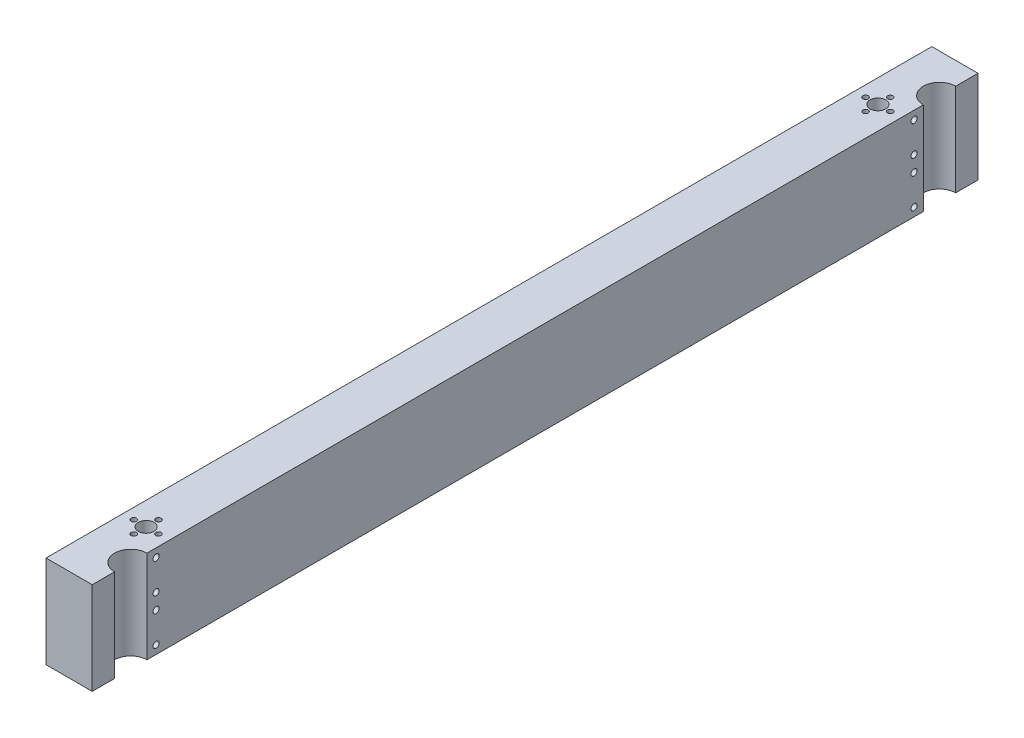
ISO-10303-21;
HEADER;
FILE_DESCRIPTION(('STEP AP214'),'2;1');
FILE_NAME('part.step','',(''),(''),'','','');
FILE_SCHEMA(('AUTOMOTIVE_DESIGN { 1 0 10303 214 1 1 1 1 }'));
ENDSEC;
DATA;
#1=APPLICATION_CONTEXT('core data for automotive mechanical design processes');
#2=APPLICATION_PROTOCOL_DEFINITION('international standard','automotive_design',2000,#1);
#3=PRODUCT_CONTEXT('',#1,'mechanical');
#4=PRODUCT('Part','Part','',(#3));
#5=PRODUCT_RELATED_PRODUCT_CATEGORY('part','',(#4));
#6=PRODUCT_DEFINITION_FORMATION('','',#4);
#7=PRODUCT_DEFINITION_CONTEXT('part definition',#1,'design');
#8=PRODUCT_DEFINITION('design','',#6,#7);
#9=PRODUCT_DEFINITION_SHAPE('','',#8);
#10=(LENGTH_UNIT() NAMED_UNIT(*) SI_UNIT(.MILLI.,.METRE.));
#11=(NAMED_UNIT(*) PLANE_ANGLE_UNIT() SI_UNIT($,.RADIAN.));
#12=(NAMED_UNIT(*) SI_UNIT($,.STERADIAN.) SOLID_ANGLE_UNIT());
#13=UNCERTAINTY_MEASURE_WITH_UNIT(LENGTH_MEASURE(1.E-05),#10,'distance_accuracy_value','');
#14=(GEOMETRIC_REPRESENTATION_CONTEXT(3) GLOBAL_UNCERTAINTY_ASSIGNED_CONTEXT((#13)) GLOBAL_UNIT_ASSIGNED_CONTEXT((#10,
#11,#12)) REPRESENTATION_CONTEXT('',''));
#15=CARTESIAN_POINT('',(0.,0.,0.));
#16=DIRECTION('',(0.,0.,1.));
#17=DIRECTION('',(1.,0.,0.));
#18=AXIS2_PLACEMENT_3D('',#15,#16,#17);
#19=CARTESIAN_POINT('',(15.,-30.,287.5));
#20=DIRECTION('',(-1.,0.,0.));
#21=DIRECTION('',(0.,0.,1.));
#22=AXIS2_PLACEMENT_3D('',#19,#20,#21);
#23=PLANE('',#22);
#24=CARTESIAN_POINT('',(15.,24.5,-246.));
#25=DIRECTION('',(-1.,0.,0.));
#26=DIRECTION('',(0.,0.,1.));
#27=AXIS2_PLACEMENT_3D('',#24,#25,#26);
#28=CIRCLE('',#27,2.);
#29=CARTESIAN_POINT('',(15.,24.5,-244.));
#30=VERTEX_POINT('',#29);
#31=EDGE_CURVE('E823',#30,#30,#28,.T.);
#32=ORIENTED_EDGE('',*,*,#31,.T.);
#33=EDGE_LOOP('',(#32));
#34=FACE_BOUND('',#33,.T.);
#35=CARTESIAN_POINT('',(15.,5.,-246.));
#36=DIRECTION('',(-1.,0.,0.));
#37=DIRECTION('',(0.,0.,1.));
#38=AXIS2_PLACEMENT_3D('',#35,#36,#37);
#39=CIRCLE('',#38,2.);
#40=CARTESIAN_POINT('',(15.,5.,-244.));
#41=VERTEX_POINT('',#40);
#42=EDGE_CURVE('E815',#41,#41,#39,.T.);
#43=ORIENTED_EDGE('',*,*,#42,.T.);
#44=EDGE_LOOP('',(#43));
#45=FACE_BOUND('',#44,.T.);
#46=CARTESIAN_POINT('',(15.,-5.,-246.));
#47=DIRECTION('',(-1.,0.,0.));
#48=DIRECTION('',(0.,0.,-1.));
#49=AXIS2_PLACEMENT_3D('',#46,#47,#48);
#50=CIRCLE('',#49,2.);
#51=CARTESIAN_POINT('',(15.,-5.,-248.));
#52=VERTEX_POINT('',#51);
#53=EDGE_CURVE('E807',#52,#52,#50,.T.);
#54=ORIENTED_EDGE('',*,*,#53,.T.);
#55=EDGE_LOOP('',(#54));
#56=FACE_BOUND('',#55,.T.);
#57=CARTESIAN_POINT('',(15.,-24.5,-246.));
#58=DIRECTION('',(-1.,0.,0.));
#59=DIRECTION('',(0.,0.,-1.));
#60=AXIS2_PLACEMENT_3D('',#57,#58,#59);
#61=CIRCLE('',#60,2.);
#62=CARTESIAN_POINT('',(15.,-24.5,-248.));
#63=VERTEX_POINT('',#62);
#64=EDGE_CURVE('E799',#63,#63,#61,.T.);
#65=ORIENTED_EDGE('',*,*,#64,.T.);
#66=EDGE_LOOP('',(#65));
#67=FACE_BOUND('',#66,.T.);
#68=CARTESIAN_POINT('',(15.,-24.5,246.));
#69=DIRECTION('',(1.,0.,0.));
#70=DIRECTION('',(0.,0.,1.));
#71=AXIS2_PLACEMENT_3D('',#68,#69,#70);
#72=CIRCLE('',#71,2.);
#73=CARTESIAN_POINT('',(15.,-24.5,248.));
#74=VERTEX_POINT('',#73);
#75=EDGE_CURVE('E248',#74,#74,#72,.T.);
#76=ORIENTED_EDGE('',*,*,#75,.F.);
#77=EDGE_LOOP('',(#76));
#78=FACE_BOUND('',#77,.T.);
#79=CARTESIAN_POINT('',(15.,-5.,246.));
#80=DIRECTION('',(1.,0.,0.));
#81=DIRECTION('',(0.,0.,1.));
#82=AXIS2_PLACEMENT_3D('',#79,#80,#81);
#83=CIRCLE('',#82,2.);
#84=CARTESIAN_POINT('',(15.,-5.,248.));
#85=VERTEX_POINT('',#84);
#86=EDGE_CURVE('E276',#85,#85,#83,.T.);
#87=ORIENTED_EDGE('',*,*,#86,.F.);
#88=EDGE_LOOP('',(#87));
#89=FACE_BOUND('',#88,.T.);
#90=CARTESIAN_POINT('',(15.,5.,246.));
#91=DIRECTION('',(1.,0.,0.));
#92=DIRECTION('',(0.,0.,-1.));
#93=AXIS2_PLACEMENT_3D('',#90,#91,#92);
#94=CIRCLE('',#93,2.);
#95=CARTESIAN_POINT('',(15.,5.,244.));
#96=VERTEX_POINT('',#95);
#97=EDGE_CURVE('E268',#96,#96,#94,.T.);
#98=ORIENTED_EDGE('',*,*,#97,.F.);
#99=EDGE_LOOP('',(#98));
#100=FACE_BOUND('',#99,.T.);
#101=CARTESIAN_POINT('',(15.,24.5,246.));
#102=DIRECTION('',(1.,0.,0.));
#103=DIRECTION('',(0.,0.,-1.));
#104=AXIS2_PLACEMENT_3D('',#101,#102,#103);
#105=CIRCLE('',#104,2.);
#106=CARTESIAN_POINT('',(15.,24.5,244.));
#107=VERTEX_POINT('',#106);
#108=EDGE_CURVE('E260',#107,#107,#105,.T.);
#109=ORIENTED_EDGE('',*,*,#108,.F.);
#110=EDGE_LOOP('',(#109));
#111=FACE_BOUND('',#110,.T.);
#112=DIRECTION('',(0.,1.,0.));
#113=VECTOR('',#112,1.);
#114=CARTESIAN_POINT('',(15.,-30.,-252.));
#115=LINE('',#114,#113);
#116=CARTESIAN_POINT('',(15.,30.,-252.));
#117=VERTEX_POINT('',#116);
#118=CARTESIAN_POINT('',(15.,-30.,-252.));
#119=VERTEX_POINT('',#118);
#120=EDGE_CURVE('E53',#117,#119,#115,.F.);
#121=ORIENTED_EDGE('',*,*,#120,.F.);
#122=DIRECTION('',(0.,0.,-1.));
#123=VECTOR('',#122,1.);
#124=CARTESIAN_POINT('',(15.,30.,287.5));
#125=LINE('',#124,#123);
#126=CARTESIAN_POINT('',(15.,30.,252.));
#127=VERTEX_POINT('',#126);
#128=EDGE_CURVE('E153',#127,#117,#125,.T.);
#129=ORIENTED_EDGE('',*,*,#128,.F.);
#130=DIRECTION('',(0.,1.,0.));
#131=VECTOR('',#130,1.);
#132=CARTESIAN_POINT('',(15.,-30.,252.));
#133=LINE('',#132,#131);
#134=CARTESIAN_POINT('',(15.,-30.,252.));
#135=VERTEX_POINT('',#134);
#136=EDGE_CURVE('E206',#127,#135,#133,.F.);
#137=ORIENTED_EDGE('',*,*,#136,.T.);
#138=DIRECTION('',(0.,0.,-1.));
#139=VECTOR('',#138,1.);
#140=CARTESIAN_POINT('',(15.,-30.,287.5));
#141=LINE('',#140,#139);
#142=EDGE_CURVE('E125',#135,#119,#141,.T.);
#143=ORIENTED_EDGE('',*,*,#142,.T.);
#144=EDGE_LOOP('',(#121,#129,#137,#143));
#145=FACE_BOUND('',#144,.T.);
#146=ADVANCED_FACE('F38',(#34,#45,#56,#67,#78,#89,#100,#111,#145),#23,.F.);
#147=DIRECTION('',(0.,1.,0.));
#148=VECTOR('',#147,1.);
#149=CARTESIAN_POINT('',(15.,-30.,-273.));
#150=LINE('',#149,#148);
#151=CARTESIAN_POINT('',(15.,-30.,-273.));
#152=VERTEX_POINT('',#151);
#153=CARTESIAN_POINT('',(15.,30.,-273.));
#154=VERTEX_POINT('',#153);
#155=EDGE_CURVE('E102',#152,#154,#150,.T.);
#156=ORIENTED_EDGE('',*,*,#155,.F.);
#157=CARTESIAN_POINT('',(15.,-30.,-287.5));
#158=VERTEX_POINT('',#157);
#159=EDGE_CURVE('E112',#152,#158,#141,.T.);
#160=ORIENTED_EDGE('',*,*,#159,.T.);
#161=DIRECTION('',(0.,1.,0.));
#162=VECTOR('',#161,1.);
#163=CARTESIAN_POINT('',(15.,-30.,-287.5));
#164=LINE('',#163,#162);
#165=CARTESIAN_POINT('',(15.,30.,-287.5));
#166=VERTEX_POINT('',#165);
#167=EDGE_CURVE('E212',#158,#166,#164,.T.);
#168=ORIENTED_EDGE('',*,*,#167,.T.);
#169=EDGE_CURVE('E114',#154,#166,#125,.T.);
#170=ORIENTED_EDGE('',*,*,#169,.F.);
#171=EDGE_LOOP('',(#156,#160,#168,#170));
#172=FACE_BOUND('',#171,.T.);
#173=ADVANCED_FACE('F110',(#172),#23,.F.);
#174=CARTESIAN_POINT('',(15.,-30.,287.5));
#175=VERTEX_POINT('',#174);
#176=CARTESIAN_POINT('',(15.,-30.,273.));
#177=VERTEX_POINT('',#176);
#178=EDGE_CURVE('E128',#175,#177,#141,.T.);
#179=ORIENTED_EDGE('',*,*,#178,.T.);
#180=DIRECTION('',(0.,1.,0.));
#181=VECTOR('',#180,1.);
#182=CARTESIAN_POINT('',(15.,-30.,273.));
#183=LINE('',#182,#181);
#184=CARTESIAN_POINT('',(15.,30.,273.));
#185=VERTEX_POINT('',#184);
#186=EDGE_CURVE('E61',#177,#185,#183,.T.);
#187=ORIENTED_EDGE('',*,*,#186,.T.);
#188=CARTESIAN_POINT('',(15.,30.,287.5));
#189=VERTEX_POINT('',#188);
#190=EDGE_CURVE('E149',#189,#185,#125,.T.);
#191=ORIENTED_EDGE('',*,*,#190,.F.);
#192=DIRECTION('',(0.,1.,0.));
#193=VECTOR('',#192,1.);
#194=CARTESIAN_POINT('',(15.,-30.,287.5));
#195=LINE('',#194,#193);
#196=EDGE_CURVE('E213',#175,#189,#195,.T.);
#197=ORIENTED_EDGE('',*,*,#196,.F.);
#198=EDGE_LOOP('',(#179,#187,#191,#197));
#199=FACE_BOUND('',#198,.T.);
#200=ADVANCED_FACE('F302',(#199),#23,.F.);
#201=CARTESIAN_POINT('',(-15.,30.,287.5));
#202=DIRECTION('',(0.,-1.,0.));
#203=DIRECTION('',(0.,0.,-1.));
#204=AXIS2_PLACEMENT_3D('',#201,#202,#203);
#205=PLANE('',#204);
#206=CARTESIAN_POINT('',(-8.,30.,-237.5));
#207=DIRECTION('',(0.,-1.,0.));
#208=DIRECTION('',(0.,0.,-1.));
#209=AXIS2_PLACEMENT_3D('',#206,#207,#208);
#210=CIRCLE('',#209,1.74999999999996);
#211=CARTESIAN_POINT('',(-8.,30.,-239.25));
#212=VERTEX_POINT('',#211);
#213=EDGE_CURVE('E780',#212,#212,#210,.T.);
#214=ORIENTED_EDGE('',*,*,#213,.T.);
#215=EDGE_LOOP('',(#214));
#216=FACE_BOUND('',#215,.T.);
#217=CARTESIAN_POINT('',(0.,30.,-229.5));
#218=DIRECTION('',(0.,-1.,0.));
#219=DIRECTION('',(0.,0.,-1.));
#220=AXIS2_PLACEMENT_3D('',#217,#218,#219);
#221=CIRCLE('',#220,1.75000000000001);
#222=CARTESIAN_POINT('',(0.,30.,-231.25));
#223=VERTEX_POINT('',#222);
#224=EDGE_CURVE('E774',#223,#223,#221,.T.);
#225=ORIENTED_EDGE('',*,*,#224,.T.);
#226=EDGE_LOOP('',(#225));
#227=FACE_BOUND('',#226,.T.);
#228=CARTESIAN_POINT('',(8.,30.,-237.5));
#229=DIRECTION('',(0.,-1.,0.));
#230=DIRECTION('',(0.,0.,-1.));
#231=AXIS2_PLACEMENT_3D('',#228,#229,#230);
#232=CIRCLE('',#231,1.75000000000004);
#233=CARTESIAN_POINT('',(8.,30.,-239.25));
#234=VERTEX_POINT('',#233);
#235=EDGE_CURVE('E793',#234,#234,#232,.T.);
#236=ORIENTED_EDGE('',*,*,#235,.T.);
#237=EDGE_LOOP('',(#236));
#238=FACE_BOUND('',#237,.T.);
#239=CARTESIAN_POINT('',(0.,30.,-245.5));
#240=DIRECTION('',(0.,-1.,0.));
#241=DIRECTION('',(0.,0.,-1.));
#242=AXIS2_PLACEMENT_3D('',#239,#240,#241);
#243=CIRCLE('',#242,1.75000000000003);
#244=CARTESIAN_POINT('',(0.,30.,-247.25));
#245=VERTEX_POINT('',#244);
#246=EDGE_CURVE('E786',#245,#245,#243,.T.);
#247=ORIENTED_EDGE('',*,*,#246,.T.);
#248=EDGE_LOOP('',(#247));
#249=FACE_BOUND('',#248,.T.);
#250=CARTESIAN_POINT('',(0.,30.,-237.5));
#251=DIRECTION('',(0.,-1.,0.));
#252=DIRECTION('',(0.,0.,-1.));
#253=AXIS2_PLACEMENT_3D('',#250,#251,#252);
#254=CIRCLE('',#253,5.1);
#255=CARTESIAN_POINT('',(0.,30.,-242.6));
#256=VERTEX_POINT('',#255);
#257=EDGE_CURVE('E756',#256,#256,#254,.T.);
#258=ORIENTED_EDGE('',*,*,#257,.T.);
#259=EDGE_LOOP('',(#258));
#260=FACE_BOUND('',#259,.T.);
#261=CARTESIAN_POINT('',(15.,30.,-262.5));
#262=DIRECTION('',(0.,-1.,0.));
#263=DIRECTION('',(0.,0.,-1.));
#264=AXIS2_PLACEMENT_3D('',#261,#262,#263);
#265=CIRCLE('',#264,10.5);
#266=EDGE_CURVE('E116',#117,#154,#265,.T.);
#267=ORIENTED_EDGE('',*,*,#266,.T.);
#268=ORIENTED_EDGE('',*,*,#169,.T.);
#269=DIRECTION('',(-1.,0.,0.));
#270=VECTOR('',#269,1.);
#271=CARTESIAN_POINT('',(-15.,30.,-287.5));
#272=LINE('',#271,#270);
#273=CARTESIAN_POINT('',(-15.,30.,-287.5));
#274=VERTEX_POINT('',#273);
#275=EDGE_CURVE('E224',#166,#274,#272,.T.);
#276=ORIENTED_EDGE('',*,*,#275,.T.);
#277=DIRECTION('',(0.,0.,-1.));
#278=VECTOR('',#277,1.);
#279=CARTESIAN_POINT('',(-15.,30.,287.5));
#280=LINE('',#279,#278);
#281=CARTESIAN_POINT('',(-15.,30.,287.5));
#282=VERTEX_POINT('',#281);
#283=EDGE_CURVE('E142',#282,#274,#280,.T.);
#284=ORIENTED_EDGE('',*,*,#283,.F.);
#285=DIRECTION('',(-1.,0.,0.));
#286=VECTOR('',#285,1.);
#287=CARTESIAN_POINT('',(-15.,30.,287.5));
#288=LINE('',#287,#286);
#289=EDGE_CURVE('E217',#189,#282,#288,.T.);
#290=ORIENTED_EDGE('',*,*,#289,.F.);
#291=ORIENTED_EDGE('',*,*,#190,.T.);
#292=CARTESIAN_POINT('',(15.,30.,262.5));
#293=DIRECTION('',(0.,1.,0.));
#294=DIRECTION('',(0.,0.,1.));
#295=AXIS2_PLACEMENT_3D('',#292,#293,#294);
#296=CIRCLE('',#295,10.5);
#297=EDGE_CURVE('E200',#127,#185,#296,.T.);
#298=ORIENTED_EDGE('',*,*,#297,.F.);
#299=ORIENTED_EDGE('',*,*,#128,.T.);
#300=EDGE_LOOP('',(#267,#268,#276,#284,#290,#291,#298,#299));
#301=FACE_BOUND('',#300,.T.);
#302=CARTESIAN_POINT('',(-8.,30.,237.5));
#303=DIRECTION('',(0.,1.,0.));
#304=DIRECTION('',(0.,0.,1.));
#305=AXIS2_PLACEMENT_3D('',#302,#303,#304);
#306=CIRCLE('',#305,1.74999999999996);
#307=CARTESIAN_POINT('',(-8.,30.,239.25));
#308=VERTEX_POINT('',#307);
#309=EDGE_CURVE('E169',#308,#308,#306,.T.);
#310=ORIENTED_EDGE('',*,*,#309,.F.);
#311=EDGE_LOOP('',(#310));
#312=FACE_BOUND('',#311,.T.);
#313=CARTESIAN_POINT('',(0.,30.,229.5));
#314=DIRECTION('',(0.,1.,0.));
#315=DIRECTION('',(0.,0.,1.));
#316=AXIS2_PLACEMENT_3D('',#313,#314,#315);
#317=CIRCLE('',#316,1.75000000000001);
#318=CARTESIAN_POINT('',(0.,30.,231.25));
#319=VERTEX_POINT('',#318);
#320=EDGE_CURVE('E183',#319,#319,#317,.T.);
#321=ORIENTED_EDGE('',*,*,#320,.F.);
#322=EDGE_LOOP('',(#321));
#323=FACE_BOUND('',#322,.T.);
#324=CARTESIAN_POINT('',(8.,30.,237.5));
#325=DIRECTION('',(0.,1.,0.));
#326=DIRECTION('',(0.,0.,1.));
#327=AXIS2_PLACEMENT_3D('',#324,#325,#326);
#328=CIRCLE('',#327,1.75000000000004);
#329=CARTESIAN_POINT('',(8.,30.,239.25));
#330=VERTEX_POINT('',#329);
#331=EDGE_CURVE('E286',#330,#330,#328,.T.);
#332=ORIENTED_EDGE('',*,*,#331,.F.);
#333=EDGE_LOOP('',(#332));
#334=FACE_BOUND('',#333,.T.);
#335=CARTESIAN_POINT('',(0.,30.,245.5));
#336=DIRECTION('',(0.,1.,0.));
#337=DIRECTION('',(0.,0.,1.));
#338=AXIS2_PLACEMENT_3D('',#335,#336,#337);
#339=CIRCLE('',#338,1.75000000000003);
#340=CARTESIAN_POINT('',(0.,30.,247.25));
#341=VERTEX_POINT('',#340);
#342=EDGE_CURVE('E177',#341,#341,#339,.T.);
#343=ORIENTED_EDGE('',*,*,#342,.F.);
#344=EDGE_LOOP('',(#343));
#345=FACE_BOUND('',#344,.T.);
#346=CARTESIAN_POINT('',(0.,30.,237.5));
#347=DIRECTION('',(0.,1.,0.));
#348=DIRECTION('',(0.,0.,1.));
#349=AXIS2_PLACEMENT_3D('',#346,#347,#348);
#350=CIRCLE('',#349,5.1);
#351=CARTESIAN_POINT('',(0.,30.,242.6));
#352=VERTEX_POINT('',#351);
#353=EDGE_CURVE('E192',#352,#352,#350,.T.);
#354=ORIENTED_EDGE('',*,*,#353,.F.);
#355=EDGE_LOOP('',(#354));
#356=FACE_BOUND('',#355,.T.);
#357=ADVANCED_FACE('F239',(#216,#227,#238,#249,#260,#301,#312,#323,#334,#345,#356),#205,.F.);
#358=CARTESIAN_POINT('',(-15.,-30.,287.5));
#359=DIRECTION('',(1.,0.,0.));
#360=DIRECTION('',(0.,0.,-1.));
#361=AXIS2_PLACEMENT_3D('',#358,#359,#360);
#362=PLANE('',#361);
#363=DIRECTION('',(0.,-1.,0.));
#364=VECTOR('',#363,1.);
#365=CARTESIAN_POINT('',(-15.,-30.,-287.5));
#366=LINE('',#365,#364);
#367=CARTESIAN_POINT('',(-15.,-30.,-287.5));
#368=VERTEX_POINT('',#367);
#369=EDGE_CURVE('E227',#274,#368,#366,.T.);
#370=ORIENTED_EDGE('',*,*,#369,.T.);
#371=DIRECTION('',(0.,0.,-1.));
#372=VECTOR('',#371,1.);
#373=CARTESIAN_POINT('',(-15.,-30.,287.5));
#374=LINE('',#373,#372);
#375=CARTESIAN_POINT('',(-15.,-30.,287.5));
#376=VERTEX_POINT('',#375);
#377=EDGE_CURVE('E137',#376,#368,#374,.T.);
#378=ORIENTED_EDGE('',*,*,#377,.F.);
#379=DIRECTION('',(0.,-1.,0.));
#380=VECTOR('',#379,1.);
#381=CARTESIAN_POINT('',(-15.,-30.,287.5));
#382=LINE('',#381,#380);
#383=EDGE_CURVE('E131',#282,#376,#382,.T.);
#384=ORIENTED_EDGE('',*,*,#383,.F.);
#385=ORIENTED_EDGE('',*,*,#283,.T.);
#386=EDGE_LOOP('',(#370,#378,#384,#385));
#387=FACE_BOUND('',#386,.T.);
#388=ADVANCED_FACE('F232',(#387),#362,.F.);
#389=CARTESIAN_POINT('',(-15.,-30.,287.5));
#390=DIRECTION('',(0.,1.,0.));
#391=DIRECTION('',(0.,0.,1.));
#392=AXIS2_PLACEMENT_3D('',#389,#390,#391);
#393=PLANE('',#392);
#394=CARTESIAN_POINT('',(-8.,-30.,-237.5));
#395=DIRECTION('',(0.,-1.,0.));
#396=DIRECTION('',(0.,0.,-1.));
#397=AXIS2_PLACEMENT_3D('',#394,#395,#396);
#398=CIRCLE('',#397,1.74999999999996);
#399=CARTESIAN_POINT('',(-8.,-30.,-239.25));
#400=VERTEX_POINT('',#399);
#401=EDGE_CURVE('E732',#400,#400,#398,.T.);
#402=ORIENTED_EDGE('',*,*,#401,.F.);
#403=EDGE_LOOP('',(#402));
#404=FACE_BOUND('',#403,.T.);
#405=CARTESIAN_POINT('',(0.,-30.,-229.5));
#406=DIRECTION('',(0.,-1.,0.));
#407=DIRECTION('',(0.,0.,-1.));
#408=AXIS2_PLACEMENT_3D('',#405,#406,#407);
#409=CIRCLE('',#408,1.75000000000001);
#410=CARTESIAN_POINT('',(0.,-30.,-231.25));
#411=VERTEX_POINT('',#410);
#412=EDGE_CURVE('E736',#411,#411,#409,.T.);
#413=ORIENTED_EDGE('',*,*,#412,.F.);
#414=EDGE_LOOP('',(#413));
#415=FACE_BOUND('',#414,.T.);
#416=CARTESIAN_POINT('',(8.,-30.,-237.5));
#417=DIRECTION('',(0.,-1.,0.));
#418=DIRECTION('',(0.,0.,-1.));
#419=AXIS2_PLACEMENT_3D('',#416,#417,#418);
#420=CIRCLE('',#419,1.75000000000004);
#421=CARTESIAN_POINT('',(8.,-30.,-239.25));
#422=VERTEX_POINT('',#421);
#423=EDGE_CURVE('E740',#422,#422,#420,.T.);
#424=ORIENTED_EDGE('',*,*,#423,.F.);
#425=EDGE_LOOP('',(#424));
#426=FACE_BOUND('',#425,.T.);
#427=CARTESIAN_POINT('',(0.,-30.,-245.5));
#428=DIRECTION('',(0.,-1.,0.));
#429=DIRECTION('',(0.,0.,-1.));
#430=AXIS2_PLACEMENT_3D('',#427,#428,#429);
#431=CIRCLE('',#430,1.75000000000003);
#432=CARTESIAN_POINT('',(0.,-30.,-247.25));
#433=VERTEX_POINT('',#432);
#434=EDGE_CURVE('E744',#433,#433,#431,.T.);
#435=ORIENTED_EDGE('',*,*,#434,.F.);
#436=EDGE_LOOP('',(#435));
#437=FACE_BOUND('',#436,.T.);
#438=CARTESIAN_POINT('',(0.,-30.,-237.5));
#439=DIRECTION('',(0.,-1.,0.));
#440=DIRECTION('',(0.,0.,-1.));
#441=AXIS2_PLACEMENT_3D('',#438,#439,#440);
#442=CIRCLE('',#441,5.1);
#443=CARTESIAN_POINT('',(0.,-30.,-242.6));
#444=VERTEX_POINT('',#443);
#445=EDGE_CURVE('E747',#444,#444,#442,.T.);
#446=ORIENTED_EDGE('',*,*,#445,.F.);
#447=EDGE_LOOP('',(#446));
#448=FACE_BOUND('',#447,.T.);
#449=CARTESIAN_POINT('',(15.,-30.,-262.5));
#450=DIRECTION('',(0.,1.,0.));
#451=DIRECTION('',(0.,0.,1.));
#452=AXIS2_PLACEMENT_3D('',#449,#450,#451);
#453=CIRCLE('',#452,10.5);
#454=EDGE_CURVE('E11',#119,#152,#453,.F.);
#455=ORIENTED_EDGE('',*,*,#454,.F.);
#456=ORIENTED_EDGE('',*,*,#142,.F.);
#457=CARTESIAN_POINT('',(15.,-30.,262.5));
#458=DIRECTION('',(0.,1.,0.));
#459=DIRECTION('',(0.,0.,1.));
#460=AXIS2_PLACEMENT_3D('',#457,#458,#459);
#461=CIRCLE('',#460,10.5);
#462=EDGE_CURVE('E47',#135,#177,#461,.T.);
#463=ORIENTED_EDGE('',*,*,#462,.T.);
#464=ORIENTED_EDGE('',*,*,#178,.F.);
#465=DIRECTION('',(1.,0.,0.));
#466=VECTOR('',#465,1.);
#467=CARTESIAN_POINT('',(-15.,-30.,287.5));
#468=LINE('',#467,#466);
#469=EDGE_CURVE('E126',#376,#175,#468,.T.);
#470=ORIENTED_EDGE('',*,*,#469,.F.);
#471=ORIENTED_EDGE('',*,*,#377,.T.);
#472=DIRECTION('',(1.,0.,0.));
#473=VECTOR('',#472,1.);
#474=CARTESIAN_POINT('',(-15.,-30.,-287.5));
#475=LINE('',#474,#473);
#476=EDGE_CURVE('E122',#368,#158,#475,.T.);
#477=ORIENTED_EDGE('',*,*,#476,.T.);
#478=ORIENTED_EDGE('',*,*,#159,.F.);
#479=EDGE_LOOP('',(#455,#456,#463,#464,#470,#471,#477,#478));
#480=FACE_BOUND('',#479,.T.);
#481=CARTESIAN_POINT('',(-8.,-30.,237.5));
#482=DIRECTION('',(0.,1.,0.));
#483=DIRECTION('',(0.,0.,1.));
#484=AXIS2_PLACEMENT_3D('',#481,#482,#483);
#485=CIRCLE('',#484,1.74999999999996);
#486=CARTESIAN_POINT('',(-8.,-30.,239.25));
#487=VERTEX_POINT('',#486);
#488=EDGE_CURVE('E160',#487,#487,#485,.T.);
#489=ORIENTED_EDGE('',*,*,#488,.T.);
#490=EDGE_LOOP('',(#489));
#491=FACE_BOUND('',#490,.T.);
#492=CARTESIAN_POINT('',(0.,-30.,229.5));
#493=DIRECTION('',(0.,1.,0.));
#494=DIRECTION('',(0.,0.,1.));
#495=AXIS2_PLACEMENT_3D('',#492,#493,#494);
#496=CIRCLE('',#495,1.75000000000001);
#497=CARTESIAN_POINT('',(0.,-30.,231.25));
#498=VERTEX_POINT('',#497);
#499=EDGE_CURVE('E174',#498,#498,#496,.T.);
#500=ORIENTED_EDGE('',*,*,#499,.T.);
#501=EDGE_LOOP('',(#500));
#502=FACE_BOUND('',#501,.T.);
#503=CARTESIAN_POINT('',(8.,-30.,237.5));
#504=DIRECTION('',(0.,1.,0.));
#505=DIRECTION('',(0.,0.,1.));
#506=AXIS2_PLACEMENT_3D('',#503,#504,#505);
#507=CIRCLE('',#506,1.75000000000004);
#508=CARTESIAN_POINT('',(8.,-30.,239.25));
#509=VERTEX_POINT('',#508);
#510=EDGE_CURVE('E186',#509,#509,#507,.T.);
#511=ORIENTED_EDGE('',*,*,#510,.T.);
#512=EDGE_LOOP('',(#511));
#513=FACE_BOUND('',#512,.T.);
#514=CARTESIAN_POINT('',(0.,-30.,245.5));
#515=DIRECTION('',(0.,1.,0.));
#516=DIRECTION('',(0.,0.,1.));
#517=AXIS2_PLACEMENT_3D('',#514,#515,#516);
#518=CIRCLE('',#517,1.75000000000003);
#519=CARTESIAN_POINT('',(0.,-30.,247.25));
#520=VERTEX_POINT('',#519);
#521=EDGE_CURVE('E289',#520,#520,#518,.T.);
#522=ORIENTED_EDGE('',*,*,#521,.T.);
#523=EDGE_LOOP('',(#522));
#524=FACE_BOUND('',#523,.T.);
#525=CARTESIAN_POINT('',(0.,-30.,237.5));
#526=DIRECTION('',(0.,1.,0.));
#527=DIRECTION('',(0.,0.,1.));
#528=AXIS2_PLACEMENT_3D('',#525,#526,#527);
#529=CIRCLE('',#528,5.1);
#530=CARTESIAN_POINT('',(0.,-30.,242.6));
#531=VERTEX_POINT('',#530);
#532=EDGE_CURVE('E166',#531,#531,#529,.T.);
#533=ORIENTED_EDGE('',*,*,#532,.T.);
#534=EDGE_LOOP('',(#533));
#535=FACE_BOUND('',#534,.T.);
#536=ADVANCED_FACE('F118',(#404,#415,#426,#437,#448,#480,#491,#502,#513,#524,#535),#393,.F.);
#537=CARTESIAN_POINT('',(0.,0.,287.5));
#538=DIRECTION('',(0.,0.,-1.));
#539=DIRECTION('',(-1.,0.,0.));
#540=AXIS2_PLACEMENT_3D('',#537,#538,#539);
#541=PLANE('',#540);
#542=ORIENTED_EDGE('',*,*,#196,.T.);
#543=ORIENTED_EDGE('',*,*,#289,.T.);
#544=ORIENTED_EDGE('',*,*,#383,.T.);
#545=ORIENTED_EDGE('',*,*,#469,.T.);
#546=EDGE_LOOP('',(#542,#543,#544,#545));
#547=FACE_BOUND('',#546,.T.);
#548=ADVANCED_FACE('F699',(#547),#541,.F.);
#549=CARTESIAN_POINT('',(0.,0.,-287.5));
#550=DIRECTION('',(0.,0.,-1.));
#551=DIRECTION('',(-1.,0.,0.));
#552=AXIS2_PLACEMENT_3D('',#549,#550,#551);
#553=PLANE('',#552);
#554=ORIENTED_EDGE('',*,*,#167,.F.);
#555=ORIENTED_EDGE('',*,*,#476,.F.);
#556=ORIENTED_EDGE('',*,*,#369,.F.);
#557=ORIENTED_EDGE('',*,*,#275,.F.);
#558=EDGE_LOOP('',(#554,#555,#556,#557));
#559=FACE_BOUND('',#558,.T.);
#560=ADVANCED_FACE('F237',(#559),#553,.T.);
#561=CARTESIAN_POINT('',(15.,-30.,262.5));
#562=DIRECTION('',(0.,1.,0.));
#563=DIRECTION('',(0.,0.,1.));
#564=AXIS2_PLACEMENT_3D('',#561,#562,#563);
#565=CYLINDRICAL_SURFACE('',#564,10.5);
#566=ORIENTED_EDGE('',*,*,#462,.F.);
#567=ORIENTED_EDGE('',*,*,#136,.F.);
#568=ORIENTED_EDGE('',*,*,#297,.T.);
#569=ORIENTED_EDGE('',*,*,#186,.F.);
#570=EDGE_LOOP('',(#566,#567,#568,#569));
#571=FACE_BOUND('',#570,.T.);
#572=ADVANCED_FACE('F309',(#571),#565,.F.);
#573=CARTESIAN_POINT('',(0.,20.,237.5));
#574=DIRECTION('',(0.,1.,0.));
#575=DIRECTION('',(0.,0.,1.));
#576=AXIS2_PLACEMENT_3D('',#573,#574,#575);
#577=CYLINDRICAL_SURFACE('',#576,5.1);
#578=CARTESIAN_POINT('',(0.,20.,237.5));
#579=DIRECTION('',(0.,1.,0.));
#580=DIRECTION('',(0.,0.,1.));
#581=AXIS2_PLACEMENT_3D('',#578,#579,#580);
#582=CIRCLE('',#581,5.1);
#583=CARTESIAN_POINT('',(0.,20.,242.6));
#584=VERTEX_POINT('',#583);
#585=EDGE_CURVE('E196',#584,#584,#582,.T.);
#586=ORIENTED_EDGE('',*,*,#585,.F.);
#587=EDGE_LOOP('',(#586));
#588=FACE_BOUND('',#587,.T.);
#589=ORIENTED_EDGE('',*,*,#353,.T.);
#590=EDGE_LOOP('',(#589));
#591=FACE_BOUND('',#590,.T.);
#592=ADVANCED_FACE('F306',(#588,#591),#577,.F.);
#593=CARTESIAN_POINT('',(0.,20.,237.5));
#594=DIRECTION('',(0.,1.,0.));
#595=DIRECTION('',(0.,0.,1.));
#596=AXIS2_PLACEMENT_3D('',#593,#594,#595);
#597=PLANE('',#596);
#598=CARTESIAN_POINT('',(0.,20.,237.5));
#599=DIRECTION('',(0.,1.,0.));
#600=DIRECTION('',(0.,0.,1.));
#601=AXIS2_PLACEMENT_3D('',#598,#599,#600);
#602=CIRCLE('',#601,4.);
#603=CARTESIAN_POINT('',(0.,20.,241.5));
#604=VERTEX_POINT('',#603);
#605=EDGE_CURVE('E159',#604,#604,#602,.T.);
#606=ORIENTED_EDGE('',*,*,#605,.F.);
#607=EDGE_LOOP('',(#606));
#608=FACE_BOUND('',#607,.T.);
#609=ORIENTED_EDGE('',*,*,#585,.T.);
#610=EDGE_LOOP('',(#609));
#611=FACE_BOUND('',#610,.T.);
#612=ADVANCED_FACE('F308',(#608,#611),#597,.T.);
#613=CARTESIAN_POINT('',(0.,-20.,237.5));
#614=DIRECTION('',(0.,-1.,0.));
#615=DIRECTION('',(0.,0.,-1.));
#616=AXIS2_PLACEMENT_3D('',#613,#614,#615);
#617=CYLINDRICAL_SURFACE('',#616,5.1);
#618=CARTESIAN_POINT('',(0.,-20.,237.5));
#619=DIRECTION('',(0.,1.,0.));
#620=DIRECTION('',(0.,0.,1.));
#621=AXIS2_PLACEMENT_3D('',#618,#619,#620);
#622=CIRCLE('',#621,5.1);
#623=CARTESIAN_POINT('',(0.,-20.,242.6));
#624=VERTEX_POINT('',#623);
#625=EDGE_CURVE('E188',#624,#624,#622,.T.);
#626=ORIENTED_EDGE('',*,*,#625,.T.);
#627=EDGE_LOOP('',(#626));
#628=FACE_BOUND('',#627,.T.);
#629=ORIENTED_EDGE('',*,*,#532,.F.);
#630=EDGE_LOOP('',(#629));
#631=FACE_BOUND('',#630,.T.);
#632=ADVANCED_FACE('F316',(#628,#631),#617,.F.);
#633=CARTESIAN_POINT('',(0.,-20.,237.5));
#634=DIRECTION('',(0.,-1.,0.));
#635=DIRECTION('',(0.,0.,1.));
#636=AXIS2_PLACEMENT_3D('',#633,#634,#635);
#637=PLANE('',#636);
#638=CARTESIAN_POINT('',(0.,-20.,237.5));
#639=DIRECTION('',(0.,-1.,0.));
#640=DIRECTION('',(0.,0.,-1.));
#641=AXIS2_PLACEMENT_3D('',#638,#639,#640);
#642=CIRCLE('',#641,4.);
#643=CARTESIAN_POINT('',(0.,-20.,233.5));
#644=VERTEX_POINT('',#643);
#645=EDGE_CURVE('E156',#644,#644,#642,.T.);
#646=ORIENTED_EDGE('',*,*,#645,.F.);
#647=EDGE_LOOP('',(#646));
#648=FACE_BOUND('',#647,.T.);
#649=ORIENTED_EDGE('',*,*,#625,.F.);
#650=EDGE_LOOP('',(#649));
#651=FACE_BOUND('',#650,.T.);
#652=ADVANCED_FACE('F357',(#648,#651),#637,.T.);
#653=CARTESIAN_POINT('',(0.,-30.,237.5));
#654=DIRECTION('',(0.,1.,0.));
#655=DIRECTION('',(0.,0.,1.));
#656=AXIS2_PLACEMENT_3D('',#653,#654,#655);
#657=CYLINDRICAL_SURFACE('',#656,4.);
#658=ORIENTED_EDGE('',*,*,#605,.T.);
#659=EDGE_LOOP('',(#658));
#660=FACE_BOUND('',#659,.T.);
#661=ORIENTED_EDGE('',*,*,#645,.T.);
#662=EDGE_LOOP('',(#661));
#663=FACE_BOUND('',#662,.T.);
#664=ADVANCED_FACE('F372',(#660,#663),#657,.F.);
#665=CARTESIAN_POINT('',(0.,-30.,245.5));
#666=DIRECTION('',(0.,1.,0.));
#667=DIRECTION('',(0.,0.,1.));
#668=AXIS2_PLACEMENT_3D('',#665,#666,#667);
#669=CYLINDRICAL_SURFACE('',#668,1.75000000000003);
#670=ORIENTED_EDGE('',*,*,#521,.F.);
#671=EDGE_LOOP('',(#670));
#672=FACE_BOUND('',#671,.T.);
#673=ORIENTED_EDGE('',*,*,#342,.T.);
#674=EDGE_LOOP('',(#673));
#675=FACE_BOUND('',#674,.T.);
#676=ADVANCED_FACE('F298',(#672,#675),#669,.F.);
#677=CARTESIAN_POINT('',(8.,-30.,237.5));
#678=DIRECTION('',(0.,1.,0.));
#679=DIRECTION('',(0.,0.,1.));
#680=AXIS2_PLACEMENT_3D('',#677,#678,#679);
#681=CYLINDRICAL_SURFACE('',#680,1.75000000000004);
#682=ORIENTED_EDGE('',*,*,#510,.F.);
#683=EDGE_LOOP('',(#682));
#684=FACE_BOUND('',#683,.T.);
#685=ORIENTED_EDGE('',*,*,#331,.T.);
#686=EDGE_LOOP('',(#685));
#687=FACE_BOUND('',#686,.T.);
#688=ADVANCED_FACE('F391',(#684,#687),#681,.F.);
#689=CARTESIAN_POINT('',(0.,-30.,229.5));
#690=DIRECTION('',(0.,1.,0.));
#691=DIRECTION('',(0.,0.,1.));
#692=AXIS2_PLACEMENT_3D('',#689,#690,#691);
#693=CYLINDRICAL_SURFACE('',#692,1.75000000000001);
#694=ORIENTED_EDGE('',*,*,#499,.F.);
#695=EDGE_LOOP('',(#694));
#696=FACE_BOUND('',#695,.T.);
#697=ORIENTED_EDGE('',*,*,#320,.T.);
#698=EDGE_LOOP('',(#697));
#699=FACE_BOUND('',#698,.T.);
#700=ADVANCED_FACE('F401',(#696,#699),#693,.F.);
#701=CARTESIAN_POINT('',(-8.,-30.,237.5));
#702=DIRECTION('',(0.,1.,0.));
#703=DIRECTION('',(0.,0.,1.));
#704=AXIS2_PLACEMENT_3D('',#701,#702,#703);
#705=CYLINDRICAL_SURFACE('',#704,1.74999999999996);
#706=ORIENTED_EDGE('',*,*,#488,.F.);
#707=EDGE_LOOP('',(#706));
#708=FACE_BOUND('',#707,.T.);
#709=ORIENTED_EDGE('',*,*,#309,.T.);
#710=EDGE_LOOP('',(#709));
#711=FACE_BOUND('',#710,.T.);
#712=ADVANCED_FACE('F411',(#708,#711),#705,.F.);
#713=CARTESIAN_POINT('',(8.,-24.5,246.));
#714=DIRECTION('',(1.,0.,0.));
#715=DIRECTION('',(0.,0.,-1.));
#716=AXIS2_PLACEMENT_3D('',#713,#714,#715);
#717=CYLINDRICAL_SURFACE('',#716,2.);
#718=CARTESIAN_POINT('',(8.,-24.5,246.));
#719=DIRECTION('',(1.,0.,0.));
#720=DIRECTION('',(0.,0.,1.));
#721=AXIS2_PLACEMENT_3D('',#718,#719,#720);
#722=CIRCLE('',#721,2.);
#723=CARTESIAN_POINT('',(8.,-24.5,248.));
#724=VERTEX_POINT('',#723);
#725=EDGE_CURVE('E252',#724,#724,#722,.T.);
#726=ORIENTED_EDGE('',*,*,#725,.F.);
#727=EDGE_LOOP('',(#726));
#728=FACE_BOUND('',#727,.T.);
#729=ORIENTED_EDGE('',*,*,#75,.T.);
#730=EDGE_LOOP('',(#729));
#731=FACE_BOUND('',#730,.T.);
#732=ADVANCED_FACE('F421',(#728,#731),#717,.F.);
#733=CARTESIAN_POINT('',(8.,-24.5,246.));
#734=DIRECTION('',(-1.,0.,0.));
#735=DIRECTION('',(0.,0.,1.));
#736=AXIS2_PLACEMENT_3D('',#733,#734,#735);
#737=PLANE('',#736);
#738=ORIENTED_EDGE('',*,*,#725,.T.);
#739=EDGE_LOOP('',(#738));
#740=FACE_BOUND('',#739,.T.);
#741=ADVANCED_FACE('F431',(#740),#737,.F.);
#742=CARTESIAN_POINT('',(8.,-5.,246.));
#743=DIRECTION('',(1.,0.,0.));
#744=DIRECTION('',(0.,0.,-1.));
#745=AXIS2_PLACEMENT_3D('',#742,#743,#744);
#746=CYLINDRICAL_SURFACE('',#745,2.);
#747=CARTESIAN_POINT('',(8.,-5.,246.));
#748=DIRECTION('',(1.,0.,0.));
#749=DIRECTION('',(0.,0.,1.));
#750=AXIS2_PLACEMENT_3D('',#747,#748,#749);
#751=CIRCLE('',#750,2.);
#752=CARTESIAN_POINT('',(8.,-5.,248.));
#753=VERTEX_POINT('',#752);
#754=EDGE_CURVE('E272',#753,#753,#751,.T.);
#755=ORIENTED_EDGE('',*,*,#754,.F.);
#756=EDGE_LOOP('',(#755));
#757=FACE_BOUND('',#756,.T.);
#758=ORIENTED_EDGE('',*,*,#86,.T.);
#759=EDGE_LOOP('',(#758));
#760=FACE_BOUND('',#759,.T.);
#761=ADVANCED_FACE('F441',(#757,#760),#746,.F.);
#762=CARTESIAN_POINT('',(8.,-5.,246.));
#763=DIRECTION('',(-1.,0.,0.));
#764=DIRECTION('',(0.,0.,1.));
#765=AXIS2_PLACEMENT_3D('',#762,#763,#764);
#766=PLANE('',#765);
#767=ORIENTED_EDGE('',*,*,#754,.T.);
#768=EDGE_LOOP('',(#767));
#769=FACE_BOUND('',#768,.T.);
#770=ADVANCED_FACE('F451',(#769),#766,.F.);
#771=CARTESIAN_POINT('',(8.,5.,246.));
#772=DIRECTION('',(1.,0.,0.));
#773=DIRECTION('',(0.,0.,-1.));
#774=AXIS2_PLACEMENT_3D('',#771,#772,#773);
#775=CYLINDRICAL_SURFACE('',#774,2.);
#776=CARTESIAN_POINT('',(8.,5.,246.));
#777=DIRECTION('',(1.,0.,0.));
#778=DIRECTION('',(0.,0.,-1.));
#779=AXIS2_PLACEMENT_3D('',#776,#777,#778);
#780=CIRCLE('',#779,2.);
#781=CARTESIAN_POINT('',(8.,5.,244.));
#782=VERTEX_POINT('',#781);
#783=EDGE_CURVE('E264',#782,#782,#780,.T.);
#784=ORIENTED_EDGE('',*,*,#783,.F.);
#785=EDGE_LOOP('',(#784));
#786=FACE_BOUND('',#785,.T.);
#787=ORIENTED_EDGE('',*,*,#97,.T.);
#788=EDGE_LOOP('',(#787));
#789=FACE_BOUND('',#788,.T.);
#790=ADVANCED_FACE('F461',(#786,#789),#775,.F.);
#791=CARTESIAN_POINT('',(8.,5.,246.));
#792=DIRECTION('',(1.,0.,0.));
#793=DIRECTION('',(0.,0.,-1.));
#794=AXIS2_PLACEMENT_3D('',#791,#792,#793);
#795=PLANE('',#794);
#796=ORIENTED_EDGE('',*,*,#783,.T.);
#797=EDGE_LOOP('',(#796));
#798=FACE_BOUND('',#797,.T.);
#799=ADVANCED_FACE('F471',(#798),#795,.T.);
#800=CARTESIAN_POINT('',(8.,24.5,246.));
#801=DIRECTION('',(1.,0.,0.));
#802=DIRECTION('',(0.,0.,-1.));
#803=AXIS2_PLACEMENT_3D('',#800,#801,#802);
#804=CYLINDRICAL_SURFACE('',#803,2.);
#805=CARTESIAN_POINT('',(8.,24.5,246.));
#806=DIRECTION('',(1.,0.,0.));
#807=DIRECTION('',(0.,0.,-1.));
#808=AXIS2_PLACEMENT_3D('',#805,#806,#807);
#809=CIRCLE('',#808,2.);
#810=CARTESIAN_POINT('',(8.,24.5,244.));
#811=VERTEX_POINT('',#810);
#812=EDGE_CURVE('E256',#811,#811,#809,.T.);
#813=ORIENTED_EDGE('',*,*,#812,.F.);
#814=EDGE_LOOP('',(#813));
#815=FACE_BOUND('',#814,.T.);
#816=ORIENTED_EDGE('',*,*,#108,.T.);
#817=EDGE_LOOP('',(#816));
#818=FACE_BOUND('',#817,.T.);
#819=ADVANCED_FACE('F481',(#815,#818),#804,.F.);
#820=CARTESIAN_POINT('',(8.,24.5,246.));
#821=DIRECTION('',(1.,0.,0.));
#822=DIRECTION('',(0.,0.,-1.));
#823=AXIS2_PLACEMENT_3D('',#820,#821,#822);
#824=PLANE('',#823);
#825=ORIENTED_EDGE('',*,*,#812,.T.);
#826=EDGE_LOOP('',(#825));
#827=FACE_BOUND('',#826,.T.);
#828=ADVANCED_FACE('F490',(#827),#824,.T.);
#829=CARTESIAN_POINT('',(15.,-30.,-262.5));
#830=DIRECTION('',(0.,1.,0.));
#831=DIRECTION('',(0.,0.,1.));
#832=AXIS2_PLACEMENT_3D('',#829,#830,#831);
#833=CYLINDRICAL_SURFACE('',#832,10.5);
#834=ORIENTED_EDGE('',*,*,#120,.T.);
#835=ORIENTED_EDGE('',*,*,#454,.T.);
#836=ORIENTED_EDGE('',*,*,#155,.T.);
#837=ORIENTED_EDGE('',*,*,#266,.F.);
#838=EDGE_LOOP('',(#834,#835,#836,#837));
#839=FACE_BOUND('',#838,.T.);
#840=ADVANCED_FACE('F101',(#839),#833,.F.);
#841=CARTESIAN_POINT('',(0.,20.,-237.5));
#842=DIRECTION('',(0.,1.,0.));
#843=DIRECTION('',(0.,0.,1.));
#844=AXIS2_PLACEMENT_3D('',#841,#842,#843);
#845=CYLINDRICAL_SURFACE('',#844,5.1);
#846=CARTESIAN_POINT('',(0.,20.,-237.5));
#847=DIRECTION('',(0.,-1.,0.));
#848=DIRECTION('',(0.,0.,-1.));
#849=AXIS2_PLACEMENT_3D('',#846,#847,#848);
#850=CIRCLE('',#849,5.1);
#851=CARTESIAN_POINT('',(0.,20.,-242.6));
#852=VERTEX_POINT('',#851);
#853=EDGE_CURVE('E761',#852,#852,#850,.T.);
#854=ORIENTED_EDGE('',*,*,#853,.T.);
#855=EDGE_LOOP('',(#854));
#856=FACE_BOUND('',#855,.T.);
#857=ORIENTED_EDGE('',*,*,#257,.F.);
#858=EDGE_LOOP('',(#857));
#859=FACE_BOUND('',#858,.T.);
#860=ADVANCED_FACE('F509',(#856,#859),#845,.F.);
#861=CARTESIAN_POINT('',(0.,20.,-237.5));
#862=DIRECTION('',(0.,1.,0.));
#863=DIRECTION('',(0.,0.,-1.));
#864=AXIS2_PLACEMENT_3D('',#861,#862,#863);
#865=PLANE('',#864);
#866=CARTESIAN_POINT('',(0.,20.,-237.5));
#867=DIRECTION('',(0.,1.,0.));
#868=DIRECTION('',(0.,0.,1.));
#869=AXIS2_PLACEMENT_3D('',#866,#867,#868);
#870=CIRCLE('',#869,4.);
#871=CARTESIAN_POINT('',(0.,20.,-233.5));
#872=VERTEX_POINT('',#871);
#873=EDGE_CURVE('E751',#872,#872,#870,.F.);
#874=ORIENTED_EDGE('',*,*,#873,.T.);
#875=EDGE_LOOP('',(#874));
#876=FACE_BOUND('',#875,.T.);
#877=ORIENTED_EDGE('',*,*,#853,.F.);
#878=EDGE_LOOP('',(#877));
#879=FACE_BOUND('',#878,.T.);
#880=ADVANCED_FACE('F517',(#876,#879),#865,.T.);
#881=CARTESIAN_POINT('',(0.,-20.,-237.5));
#882=DIRECTION('',(0.,-1.,0.));
#883=DIRECTION('',(0.,0.,-1.));
#884=AXIS2_PLACEMENT_3D('',#881,#882,#883);
#885=CYLINDRICAL_SURFACE('',#884,5.1);
#886=CARTESIAN_POINT('',(0.,-20.,-237.5));
#887=DIRECTION('',(0.,-1.,0.));
#888=DIRECTION('',(0.,0.,-1.));
#889=AXIS2_PLACEMENT_3D('',#886,#887,#888);
#890=CIRCLE('',#889,5.1);
#891=CARTESIAN_POINT('',(0.,-20.,-242.6));
#892=VERTEX_POINT('',#891);
#893=EDGE_CURVE('E750',#892,#892,#890,.T.);
#894=ORIENTED_EDGE('',*,*,#893,.F.);
#895=EDGE_LOOP('',(#894));
#896=FACE_BOUND('',#895,.T.);
#897=ORIENTED_EDGE('',*,*,#445,.T.);
#898=EDGE_LOOP('',(#897));
#899=FACE_BOUND('',#898,.T.);
#900=ADVANCED_FACE('F525',(#896,#899),#885,.F.);
#901=CARTESIAN_POINT('',(0.,-20.,-237.5));
#902=DIRECTION('',(0.,-1.,0.));
#903=DIRECTION('',(0.,0.,-1.));
#904=AXIS2_PLACEMENT_3D('',#901,#902,#903);
#905=PLANE('',#904);
#906=CARTESIAN_POINT('',(0.,-20.,-237.5));
#907=DIRECTION('',(0.,-1.,0.));
#908=DIRECTION('',(0.,0.,-1.));
#909=AXIS2_PLACEMENT_3D('',#906,#907,#908);
#910=CIRCLE('',#909,4.);
#911=CARTESIAN_POINT('',(0.,-20.,-241.5));
#912=VERTEX_POINT('',#911);
#913=EDGE_CURVE('E41',#912,#912,#910,.F.);
#914=ORIENTED_EDGE('',*,*,#913,.T.);
#915=EDGE_LOOP('',(#914));
#916=FACE_BOUND('',#915,.T.);
#917=ORIENTED_EDGE('',*,*,#893,.T.);
#918=EDGE_LOOP('',(#917));
#919=FACE_BOUND('',#918,.T.);
#920=ADVANCED_FACE('F533',(#916,#919),#905,.T.);
#921=CARTESIAN_POINT('',(0.,-30.,-237.5));
#922=DIRECTION('',(0.,1.,0.));
#923=DIRECTION('',(0.,0.,1.));
#924=AXIS2_PLACEMENT_3D('',#921,#922,#923);
#925=CYLINDRICAL_SURFACE('',#924,4.);
#926=ORIENTED_EDGE('',*,*,#873,.F.);
#927=EDGE_LOOP('',(#926));
#928=FACE_BOUND('',#927,.T.);
#929=ORIENTED_EDGE('',*,*,#913,.F.);
#930=EDGE_LOOP('',(#929));
#931=FACE_BOUND('',#930,.T.);
#932=ADVANCED_FACE('F541',(#928,#931),#925,.F.);
#933=CARTESIAN_POINT('',(0.,-30.,-245.5));
#934=DIRECTION('',(0.,1.,0.));
#935=DIRECTION('',(0.,0.,1.));
#936=AXIS2_PLACEMENT_3D('',#933,#934,#935);
#937=CYLINDRICAL_SURFACE('',#936,1.75000000000003);
#938=ORIENTED_EDGE('',*,*,#434,.T.);
#939=EDGE_LOOP('',(#938));
#940=FACE_BOUND('',#939,.T.);
#941=ORIENTED_EDGE('',*,*,#246,.F.);
#942=EDGE_LOOP('',(#941));
#943=FACE_BOUND('',#942,.T.);
#944=ADVANCED_FACE('F549',(#940,#943),#937,.F.);
#945=CARTESIAN_POINT('',(8.,-30.,-237.5));
#946=DIRECTION('',(0.,1.,0.));
#947=DIRECTION('',(0.,0.,1.));
#948=AXIS2_PLACEMENT_3D('',#945,#946,#947);
#949=CYLINDRICAL_SURFACE('',#948,1.75000000000004);
#950=ORIENTED_EDGE('',*,*,#423,.T.);
#951=EDGE_LOOP('',(#950));
#952=FACE_BOUND('',#951,.T.);
#953=ORIENTED_EDGE('',*,*,#235,.F.);
#954=EDGE_LOOP('',(#953));
#955=FACE_BOUND('',#954,.T.);
#956=ADVANCED_FACE('F557',(#952,#955),#949,.F.);
#957=CARTESIAN_POINT('',(0.,-30.,-229.5));
#958=DIRECTION('',(0.,1.,0.));
#959=DIRECTION('',(0.,0.,1.));
#960=AXIS2_PLACEMENT_3D('',#957,#958,#959);
#961=CYLINDRICAL_SURFACE('',#960,1.75000000000001);
#962=ORIENTED_EDGE('',*,*,#412,.T.);
#963=EDGE_LOOP('',(#962));
#964=FACE_BOUND('',#963,.T.);
#965=ORIENTED_EDGE('',*,*,#224,.F.);
#966=EDGE_LOOP('',(#965));
#967=FACE_BOUND('',#966,.T.);
#968=ADVANCED_FACE('F565',(#964,#967),#961,.F.);
#969=CARTESIAN_POINT('',(-8.,-30.,-237.5));
#970=DIRECTION('',(0.,1.,0.));
#971=DIRECTION('',(0.,0.,1.));
#972=AXIS2_PLACEMENT_3D('',#969,#970,#971);
#973=CYLINDRICAL_SURFACE('',#972,1.74999999999996);
#974=ORIENTED_EDGE('',*,*,#401,.T.);
#975=EDGE_LOOP('',(#974));
#976=FACE_BOUND('',#975,.T.);
#977=ORIENTED_EDGE('',*,*,#213,.F.);
#978=EDGE_LOOP('',(#977));
#979=FACE_BOUND('',#978,.T.);
#980=ADVANCED_FACE('F573',(#976,#979),#973,.F.);
#981=CARTESIAN_POINT('',(8.,-24.5,-246.));
#982=DIRECTION('',(1.,0.,0.));
#983=DIRECTION('',(0.,0.,-1.));
#984=AXIS2_PLACEMENT_3D('',#981,#982,#983);
#985=CYLINDRICAL_SURFACE('',#984,2.);
#986=CARTESIAN_POINT('',(8.,-24.5,-246.));
#987=DIRECTION('',(-1.,0.,0.));
#988=DIRECTION('',(0.,0.,-1.));
#989=AXIS2_PLACEMENT_3D('',#986,#987,#988);
#990=CIRCLE('',#989,2.);
#991=CARTESIAN_POINT('',(8.,-24.5,-248.));
#992=VERTEX_POINT('',#991);
#993=EDGE_CURVE('E803',#992,#992,#990,.T.);
#994=ORIENTED_EDGE('',*,*,#993,.T.);
#995=EDGE_LOOP('',(#994));
#996=FACE_BOUND('',#995,.T.);
#997=ORIENTED_EDGE('',*,*,#64,.F.);
#998=EDGE_LOOP('',(#997));
#999=FACE_BOUND('',#998,.T.);
#1000=ADVANCED_FACE('F581',(#996,#999),#985,.F.);
#1001=CARTESIAN_POINT('',(8.,-24.5,-246.));
#1002=DIRECTION('',(-1.,0.,0.));
#1003=DIRECTION('',(0.,0.,-1.));
#1004=AXIS2_PLACEMENT_3D('',#1001,#1002,#1003);
#1005=PLANE('',#1004);
#1006=ORIENTED_EDGE('',*,*,#993,.F.);
#1007=EDGE_LOOP('',(#1006));
#1008=FACE_BOUND('',#1007,.T.);
#1009=ADVANCED_FACE('F589',(#1008),#1005,.F.);
#1010=CARTESIAN_POINT('',(8.,-5.,-246.));
#1011=DIRECTION('',(1.,0.,0.));
#1012=DIRECTION('',(0.,0.,-1.));
#1013=AXIS2_PLACEMENT_3D('',#1010,#1011,#1012);
#1014=CYLINDRICAL_SURFACE('',#1013,2.);
#1015=CARTESIAN_POINT('',(8.,-5.,-246.));
#1016=DIRECTION('',(-1.,0.,0.));
#1017=DIRECTION('',(0.,0.,-1.));
#1018=AXIS2_PLACEMENT_3D('',#1015,#1016,#1017);
#1019=CIRCLE('',#1018,2.);
#1020=CARTESIAN_POINT('',(8.,-5.,-248.));
#1021=VERTEX_POINT('',#1020);
#1022=EDGE_CURVE('E811',#1021,#1021,#1019,.T.);
#1023=ORIENTED_EDGE('',*,*,#1022,.T.);
#1024=EDGE_LOOP('',(#1023));
#1025=FACE_BOUND('',#1024,.T.);
#1026=ORIENTED_EDGE('',*,*,#53,.F.);
#1027=EDGE_LOOP('',(#1026));
#1028=FACE_BOUND('',#1027,.T.);
#1029=ADVANCED_FACE('F597',(#1025,#1028),#1014,.F.);
#1030=CARTESIAN_POINT('',(8.,-5.,-246.));
#1031=DIRECTION('',(-1.,0.,0.));
#1032=DIRECTION('',(0.,0.,-1.));
#1033=AXIS2_PLACEMENT_3D('',#1030,#1031,#1032);
#1034=PLANE('',#1033);
#1035=ORIENTED_EDGE('',*,*,#1022,.F.);
#1036=EDGE_LOOP('',(#1035));
#1037=FACE_BOUND('',#1036,.T.);
#1038=ADVANCED_FACE('F605',(#1037),#1034,.F.);
#1039=CARTESIAN_POINT('',(8.,5.,-246.));
#1040=DIRECTION('',(1.,0.,0.));
#1041=DIRECTION('',(0.,0.,-1.));
#1042=AXIS2_PLACEMENT_3D('',#1039,#1040,#1041);
#1043=CYLINDRICAL_SURFACE('',#1042,2.);
#1044=CARTESIAN_POINT('',(8.,5.,-246.));
#1045=DIRECTION('',(-1.,0.,0.));
#1046=DIRECTION('',(0.,0.,1.));
#1047=AXIS2_PLACEMENT_3D('',#1044,#1045,#1046);
#1048=CIRCLE('',#1047,2.);
#1049=CARTESIAN_POINT('',(8.,5.,-244.));
#1050=VERTEX_POINT('',#1049);
#1051=EDGE_CURVE('E819',#1050,#1050,#1048,.T.);
#1052=ORIENTED_EDGE('',*,*,#1051,.T.);
#1053=EDGE_LOOP('',(#1052));
#1054=FACE_BOUND('',#1053,.T.);
#1055=ORIENTED_EDGE('',*,*,#42,.F.);
#1056=EDGE_LOOP('',(#1055));
#1057=FACE_BOUND('',#1056,.T.);
#1058=ADVANCED_FACE('F613',(#1054,#1057),#1043,.F.);
#1059=CARTESIAN_POINT('',(8.,5.,-246.));
#1060=DIRECTION('',(1.,0.,0.));
#1061=DIRECTION('',(0.,0.,1.));
#1062=AXIS2_PLACEMENT_3D('',#1059,#1060,#1061);
#1063=PLANE('',#1062);
#1064=ORIENTED_EDGE('',*,*,#1051,.F.);
#1065=EDGE_LOOP('',(#1064));
#1066=FACE_BOUND('',#1065,.T.);
#1067=ADVANCED_FACE('F621',(#1066),#1063,.T.);
#1068=CARTESIAN_POINT('',(8.,24.5,-246.));
#1069=DIRECTION('',(1.,0.,0.));
#1070=DIRECTION('',(0.,0.,-1.));
#1071=AXIS2_PLACEMENT_3D('',#1068,#1069,#1070);
#1072=CYLINDRICAL_SURFACE('',#1071,2.);
#1073=CARTESIAN_POINT('',(8.,24.5,-246.));
#1074=DIRECTION('',(-1.,0.,0.));
#1075=DIRECTION('',(0.,0.,1.));
#1076=AXIS2_PLACEMENT_3D('',#1073,#1074,#1075);
#1077=CIRCLE('',#1076,2.);
#1078=CARTESIAN_POINT('',(8.,24.5,-244.));
#1079=VERTEX_POINT('',#1078);
#1080=EDGE_CURVE('E790',#1079,#1079,#1077,.T.);
#1081=ORIENTED_EDGE('',*,*,#1080,.T.);
#1082=EDGE_LOOP('',(#1081));
#1083=FACE_BOUND('',#1082,.T.);
#1084=ORIENTED_EDGE('',*,*,#31,.F.);
#1085=EDGE_LOOP('',(#1084));
#1086=FACE_BOUND('',#1085,.T.);
#1087=ADVANCED_FACE('F629',(#1083,#1086),#1072,.F.);
#1088=CARTESIAN_POINT('',(8.,24.5,-246.));
#1089=DIRECTION('',(1.,0.,0.));
#1090=DIRECTION('',(0.,0.,1.));
#1091=AXIS2_PLACEMENT_3D('',#1088,#1089,#1090);
#1092=PLANE('',#1091);
#1093=ORIENTED_EDGE('',*,*,#1080,.F.);
#1094=EDGE_LOOP('',(#1093));
#1095=FACE_BOUND('',#1094,.T.);
#1096=ADVANCED_FACE('F637',(#1095),#1092,.T.);
#1097=CLOSED_SHELL('',(#146,#173,#200,#357,#388,#536,#548,#560,#572,#592,#612,#632,#652,#664,
#676,#688,#700,#712,#732,#741,#761,#770,#790,#799,#819,#828,#840,#860,#880,#900,#920,#932,#944,
#956,#968,#980,#1000,#1009,#1029,#1038,#1058,#1067,#1087,#1096));
#1098=MANIFOLD_SOLID_BREP('B2',#1097);
#1099=ADVANCED_BREP_SHAPE_REPRESENTATION('',(#18,#1098),#14);
#1100=SHAPE_DEFINITION_REPRESENTATION(#9,#1099);
ENDSEC;
END-ISO-10303-21;
